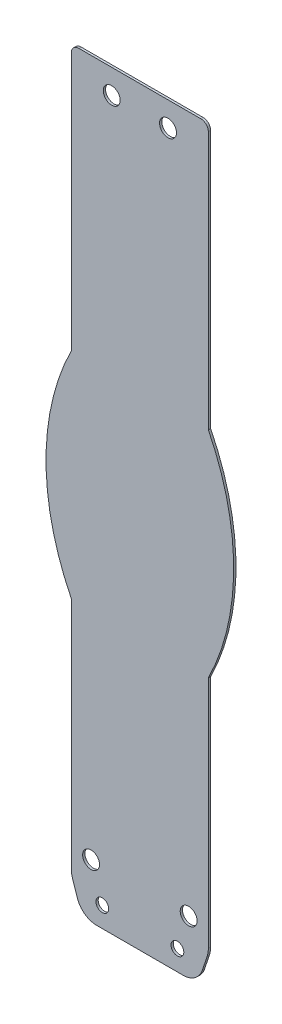
ISO-10303-21;
HEADER;
FILE_DESCRIPTION(('STEP AP214'),'2;1');
FILE_NAME('part.step','',(''),(''),'','','');
FILE_SCHEMA(('AUTOMOTIVE_DESIGN { 1 0 10303 214 1 1 1 1 }'));
ENDSEC;
DATA;
#1=APPLICATION_CONTEXT('core data for automotive mechanical design processes');
#2=APPLICATION_PROTOCOL_DEFINITION('international standard','automotive_design',2000,#1);
#3=PRODUCT_CONTEXT('',#1,'mechanical');
#4=PRODUCT('Part','Part','',(#3));
#5=PRODUCT_RELATED_PRODUCT_CATEGORY('part','',(#4));
#6=PRODUCT_DEFINITION_FORMATION('','',#4);
#7=PRODUCT_DEFINITION_CONTEXT('part definition',#1,'design');
#8=PRODUCT_DEFINITION('design','',#6,#7);
#9=PRODUCT_DEFINITION_SHAPE('','',#8);
#10=(LENGTH_UNIT() NAMED_UNIT(*) SI_UNIT(.MILLI.,.METRE.));
#11=(NAMED_UNIT(*) PLANE_ANGLE_UNIT() SI_UNIT($,.RADIAN.));
#12=(NAMED_UNIT(*) SI_UNIT($,.STERADIAN.) SOLID_ANGLE_UNIT());
#13=UNCERTAINTY_MEASURE_WITH_UNIT(LENGTH_MEASURE(1.E-05),#10,'distance_accuracy_value','');
#14=(GEOMETRIC_REPRESENTATION_CONTEXT(3) GLOBAL_UNCERTAINTY_ASSIGNED_CONTEXT((#13)) GLOBAL_UNIT_ASSIGNED_CONTEXT((#10,
#11,#12)) REPRESENTATION_CONTEXT('',''));
#15=CARTESIAN_POINT('',(0.,0.,0.));
#16=DIRECTION('',(0.,0.,1.));
#17=DIRECTION('',(1.,0.,0.));
#18=AXIS2_PLACEMENT_3D('',#15,#16,#17);
#19=CARTESIAN_POINT('',(36.5,9.57634436545453,0.6096));
#20=DIRECTION('',(-1.,0.,0.));
#21=DIRECTION('',(0.,0.,1.));
#22=AXIS2_PLACEMENT_3D('',#19,#20,#21);
#23=PLANE('',#22);
#24=DIRECTION('',(0.,0.,1.));
#25=VECTOR('',#24,1.);
#26=CARTESIAN_POINT('',(36.5,129.225,-75.9914509994381));
#27=LINE('',#26,#25);
#28=CARTESIAN_POINT('',(36.5,129.225,0.));
#29=VERTEX_POINT('',#28);
#30=CARTESIAN_POINT('',(36.5,129.225,0.6096));
#31=VERTEX_POINT('',#30);
#32=EDGE_CURVE('E178',#29,#31,#27,.T.);
#33=ORIENTED_EDGE('',*,*,#32,.F.);
#34=DIRECTION('',(0.,1.,0.));
#35=VECTOR('',#34,1.);
#36=CARTESIAN_POINT('',(36.5,9.57634436545453,0.));
#37=LINE('',#36,#35);
#38=CARTESIAN_POINT('',(36.5,198.,0.));
#39=VERTEX_POINT('',#38);
#40=EDGE_CURVE('E281',#29,#39,#37,.T.);
#41=ORIENTED_EDGE('',*,*,#40,.T.);
#42=DIRECTION('',(0.,0.,-1.));
#43=VECTOR('',#42,1.);
#44=CARTESIAN_POINT('',(36.5,198.,0.6096));
#45=LINE('',#44,#43);
#46=CARTESIAN_POINT('',(36.5,198.,0.6096));
#47=VERTEX_POINT('',#46);
#48=EDGE_CURVE('E181',#47,#39,#45,.T.);
#49=ORIENTED_EDGE('',*,*,#48,.F.);
#50=DIRECTION('',(0.,1.,0.));
#51=VECTOR('',#50,1.);
#52=CARTESIAN_POINT('',(36.5,9.57634436545453,0.6096));
#53=LINE('',#52,#51);
#54=EDGE_CURVE('E176',#31,#47,#53,.T.);
#55=ORIENTED_EDGE('',*,*,#54,.F.);
#56=EDGE_LOOP('',(#33,#41,#49,#55));
#57=FACE_BOUND('',#56,.T.);
#58=ADVANCED_FACE('F63',(#57),#23,.F.);
#59=CARTESIAN_POINT('',(0.,9.57634436545456,0.6096));
#60=DIRECTION('',(1.,0.,0.));
#61=DIRECTION('',(0.,0.,-1.));
#62=AXIS2_PLACEMENT_3D('',#59,#60,#61);
#63=PLANE('',#62);
#64=DIRECTION('',(0.,0.,1.));
#65=VECTOR('',#64,1.);
#66=CARTESIAN_POINT('',(0.,72.,-75.9914509994381));
#67=LINE('',#66,#65);
#68=CARTESIAN_POINT('',(0.,72.,0.));
#69=VERTEX_POINT('',#68);
#70=CARTESIAN_POINT('',(0.,72.,0.609600000000002));
#71=VERTEX_POINT('',#70);
#72=EDGE_CURVE('E209',#69,#71,#67,.T.);
#73=ORIENTED_EDGE('',*,*,#72,.F.);
#74=DIRECTION('',(0.,-1.,0.));
#75=VECTOR('',#74,1.);
#76=CARTESIAN_POINT('',(0.,9.57634436545456,0.));
#77=LINE('',#76,#75);
#78=CARTESIAN_POINT('',(0.,9.57634436545456,0.));
#79=VERTEX_POINT('',#78);
#80=EDGE_CURVE('E290',#69,#79,#77,.T.);
#81=ORIENTED_EDGE('',*,*,#80,.T.);
#82=DIRECTION('',(0.,0.,-1.));
#83=VECTOR('',#82,1.);
#84=CARTESIAN_POINT('',(0.,9.57634436545456,0.6096));
#85=LINE('',#84,#83);
#86=CARTESIAN_POINT('',(0.,9.57634436545456,0.6096));
#87=VERTEX_POINT('',#86);
#88=EDGE_CURVE('E311',#87,#79,#85,.T.);
#89=ORIENTED_EDGE('',*,*,#88,.F.);
#90=DIRECTION('',(0.,-1.,0.));
#91=VECTOR('',#90,1.);
#92=CARTESIAN_POINT('',(0.,9.57634436545456,0.6096));
#93=LINE('',#92,#91);
#94=EDGE_CURVE('E78',#71,#87,#93,.T.);
#95=ORIENTED_EDGE('',*,*,#94,.F.);
#96=EDGE_LOOP('',(#73,#81,#89,#95));
#97=FACE_BOUND('',#96,.T.);
#98=ADVANCED_FACE('F355',(#97),#63,.F.);
#99=DIRECTION('',(0.,0.,1.));
#100=VECTOR('',#99,1.);
#101=CARTESIAN_POINT('',(0.,129.225,-75.9914509994381));
#102=LINE('',#101,#100);
#103=CARTESIAN_POINT('',(0.,129.225,0.));
#104=VERTEX_POINT('',#103);
#105=CARTESIAN_POINT('',(0.,129.225,0.6096));
#106=VERTEX_POINT('',#105);
#107=EDGE_CURVE('E86',#104,#106,#102,.T.);
#108=ORIENTED_EDGE('',*,*,#107,.T.);
#109=CARTESIAN_POINT('',(0.,198.,0.6096));
#110=VERTEX_POINT('',#109);
#111=EDGE_CURVE('E264',#110,#106,#93,.T.);
#112=ORIENTED_EDGE('',*,*,#111,.F.);
#113=DIRECTION('',(0.,0.,-1.));
#114=VECTOR('',#113,1.);
#115=CARTESIAN_POINT('',(0.,198.,0.6096));
#116=LINE('',#115,#114);
#117=CARTESIAN_POINT('',(0.,198.,0.));
#118=VERTEX_POINT('',#117);
#119=EDGE_CURVE('E314',#110,#118,#116,.T.);
#120=ORIENTED_EDGE('',*,*,#119,.T.);
#121=EDGE_CURVE('E291',#118,#104,#77,.T.);
#122=ORIENTED_EDGE('',*,*,#121,.T.);
#123=EDGE_LOOP('',(#108,#112,#120,#122));
#124=FACE_BOUND('',#123,.T.);
#125=ADVANCED_FACE('F359',(#124),#63,.F.);
#126=CARTESIAN_POINT('',(29.7625562615952,5.4,0.6096));
#127=DIRECTION('',(0.,0.,-1.));
#128=DIRECTION('',(-1.,0.,0.));
#129=AXIS2_PLACEMENT_3D('',#126,#127,#128);
#130=CYLINDRICAL_SURFACE('',#129,5.4);
#131=CARTESIAN_POINT('',(29.7625562615952,5.4,0.));
#132=DIRECTION('',(0.,0.,1.));
#133=DIRECTION('',(-1.,0.,0.));
#134=AXIS2_PLACEMENT_3D('',#131,#132,#133);
#135=CIRCLE('',#134,5.4);
#136=CARTESIAN_POINT('',(29.7625562615952,0.,0.));
#137=VERTEX_POINT('',#136);
#138=CARTESIAN_POINT('',(34.8835039997087,3.68655485541252,0.));
#139=VERTEX_POINT('',#138);
#140=EDGE_CURVE('E248',#137,#139,#135,.T.);
#141=ORIENTED_EDGE('',*,*,#140,.T.);
#142=DIRECTION('',(0.,0.,-1.));
#143=VECTOR('',#142,1.);
#144=CARTESIAN_POINT('',(34.8835039997087,3.68655485541252,0.6096));
#145=LINE('',#144,#143);
#146=CARTESIAN_POINT('',(34.8835039997087,3.68655485541252,0.6096));
#147=VERTEX_POINT('',#146);
#148=EDGE_CURVE('E12',#147,#139,#145,.T.);
#149=ORIENTED_EDGE('',*,*,#148,.F.);
#150=CARTESIAN_POINT('',(29.7625562615952,5.4,0.6096));
#151=DIRECTION('',(0.,0.,1.));
#152=DIRECTION('',(-1.,0.,0.));
#153=AXIS2_PLACEMENT_3D('',#150,#151,#152);
#154=CIRCLE('',#153,5.4);
#155=CARTESIAN_POINT('',(29.7625562615952,0.,0.6096));
#156=VERTEX_POINT('',#155);
#157=EDGE_CURVE('E251',#156,#147,#154,.T.);
#158=ORIENTED_EDGE('',*,*,#157,.F.);
#159=DIRECTION('',(0.,0.,-1.));
#160=VECTOR('',#159,1.);
#161=CARTESIAN_POINT('',(29.7625562615952,0.,0.6096));
#162=LINE('',#161,#160);
#163=EDGE_CURVE('E274',#156,#137,#162,.T.);
#164=ORIENTED_EDGE('',*,*,#163,.T.);
#165=EDGE_LOOP('',(#141,#149,#158,#164));
#166=FACE_BOUND('',#165,.T.);
#167=ADVANCED_FACE('F65',(#166),#130,.T.);
#168=CARTESIAN_POINT('',(34.8835039997087,3.68655485541252,0.6096));
#169=DIRECTION('',(-0.948323655206201,0.317304656405088,0.));
#170=DIRECTION('',(-0.317304656405088,-0.948323655206201,0.));
#171=AXIS2_PLACEMENT_3D('',#168,#169,#170);
#172=PLANE('',#171);
#173=DIRECTION('',(0.317304656405088,0.948323655206201,0.));
#174=VECTOR('',#173,1.);
#175=CARTESIAN_POINT('',(34.8835039997087,3.68655485541252,0.));
#176=LINE('',#175,#174);
#177=CARTESIAN_POINT('',(36.1641037588403,7.51386409882145,0.));
#178=VERTEX_POINT('',#177);
#179=EDGE_CURVE('E277',#139,#178,#176,.T.);
#180=ORIENTED_EDGE('',*,*,#179,.T.);
#181=DIRECTION('',(0.,0.,-1.));
#182=VECTOR('',#181,1.);
#183=CARTESIAN_POINT('',(36.1641037588403,7.51386409882145,0.6096));
#184=LINE('',#183,#182);
#185=CARTESIAN_POINT('',(36.1641037588403,7.51386409882145,0.6096));
#186=VERTEX_POINT('',#185);
#187=EDGE_CURVE('E71',#186,#178,#184,.T.);
#188=ORIENTED_EDGE('',*,*,#187,.F.);
#189=DIRECTION('',(0.317304656405088,0.948323655206201,0.));
#190=VECTOR('',#189,1.);
#191=CARTESIAN_POINT('',(34.8835039997087,3.68655485541252,0.6096));
#192=LINE('',#191,#190);
#193=EDGE_CURVE('E254',#147,#186,#192,.T.);
#194=ORIENTED_EDGE('',*,*,#193,.F.);
#195=ORIENTED_EDGE('',*,*,#148,.T.);
#196=EDGE_LOOP('',(#180,#188,#194,#195));
#197=FACE_BOUND('',#196,.T.);
#198=ADVANCED_FACE('F352',(#197),#172,.F.);
#199=CARTESIAN_POINT('',(30.,9.57634436545453,0.6096));
#200=DIRECTION('',(0.,0.,-1.));
#201=DIRECTION('',(-1.,0.,0.));
#202=AXIS2_PLACEMENT_3D('',#199,#200,#201);
#203=CYLINDRICAL_SURFACE('',#202,6.5);
#204=CARTESIAN_POINT('',(30.,9.57634436545453,0.));
#205=DIRECTION('',(0.,0.,1.));
#206=DIRECTION('',(1.,0.,0.));
#207=AXIS2_PLACEMENT_3D('',#204,#205,#206);
#208=CIRCLE('',#207,6.5);
#209=CARTESIAN_POINT('',(36.5,9.57634436545453,0.));
#210=VERTEX_POINT('',#209);
#211=EDGE_CURVE('E279',#178,#210,#208,.T.);
#212=ORIENTED_EDGE('',*,*,#211,.T.);
#213=DIRECTION('',(0.,0.,-1.));
#214=VECTOR('',#213,1.);
#215=CARTESIAN_POINT('',(36.5,9.57634436545453,0.6096));
#216=LINE('',#215,#214);
#217=CARTESIAN_POINT('',(36.5,9.57634436545453,0.6096));
#218=VERTEX_POINT('',#217);
#219=EDGE_CURVE('E324',#218,#210,#216,.T.);
#220=ORIENTED_EDGE('',*,*,#219,.F.);
#221=CARTESIAN_POINT('',(30.,9.57634436545453,0.6096));
#222=DIRECTION('',(0.,0.,1.));
#223=DIRECTION('',(1.,0.,0.));
#224=AXIS2_PLACEMENT_3D('',#221,#222,#223);
#225=CIRCLE('',#224,6.5);
#226=EDGE_CURVE('E186',#186,#218,#225,.T.);
#227=ORIENTED_EDGE('',*,*,#226,.F.);
#228=ORIENTED_EDGE('',*,*,#187,.T.);
#229=EDGE_LOOP('',(#212,#220,#227,#228));
#230=FACE_BOUND('',#229,.T.);
#231=ADVANCED_FACE('F331',(#230),#203,.T.);
#232=CARTESIAN_POINT('',(36.5,72.,0.));
#233=VERTEX_POINT('',#232);
#234=EDGE_CURVE('E282',#210,#233,#37,.T.);
#235=ORIENTED_EDGE('',*,*,#234,.T.);
#236=DIRECTION('',(0.,0.,1.));
#237=VECTOR('',#236,1.);
#238=CARTESIAN_POINT('',(36.5,72.,-75.9914509994381));
#239=LINE('',#238,#237);
#240=CARTESIAN_POINT('',(36.5,72.,0.609600000000002));
#241=VERTEX_POINT('',#240);
#242=EDGE_CURVE('E212',#233,#241,#239,.T.);
#243=ORIENTED_EDGE('',*,*,#242,.T.);
#244=EDGE_CURVE('E185',#218,#241,#53,.T.);
#245=ORIENTED_EDGE('',*,*,#244,.F.);
#246=ORIENTED_EDGE('',*,*,#219,.T.);
#247=EDGE_LOOP('',(#235,#243,#245,#246));
#248=FACE_BOUND('',#247,.T.);
#249=ADVANCED_FACE('F341',(#248),#23,.F.);
#250=CARTESIAN_POINT('',(34.5,198.,0.6096));
#251=DIRECTION('',(0.,0.,-1.));
#252=DIRECTION('',(-1.,0.,0.));
#253=AXIS2_PLACEMENT_3D('',#250,#251,#252);
#254=CYLINDRICAL_SURFACE('',#253,2.);
#255=CARTESIAN_POINT('',(34.5,198.,0.));
#256=DIRECTION('',(0.,0.,1.));
#257=DIRECTION('',(-1.,0.,0.));
#258=AXIS2_PLACEMENT_3D('',#255,#256,#257);
#259=CIRCLE('',#258,2.);
#260=CARTESIAN_POINT('',(34.5,200.,0.));
#261=VERTEX_POINT('',#260);
#262=EDGE_CURVE('E284',#39,#261,#259,.T.);
#263=ORIENTED_EDGE('',*,*,#262,.T.);
#264=DIRECTION('',(0.,0.,-1.));
#265=VECTOR('',#264,1.);
#266=CARTESIAN_POINT('',(34.5,200.,0.6096));
#267=LINE('',#266,#265);
#268=CARTESIAN_POINT('',(34.5,200.,0.6096));
#269=VERTEX_POINT('',#268);
#270=EDGE_CURVE('E320',#269,#261,#267,.T.);
#271=ORIENTED_EDGE('',*,*,#270,.F.);
#272=CARTESIAN_POINT('',(34.5,198.,0.6096));
#273=DIRECTION('',(0.,0.,1.));
#274=DIRECTION('',(-1.,0.,0.));
#275=AXIS2_PLACEMENT_3D('',#272,#273,#274);
#276=CIRCLE('',#275,2.);
#277=EDGE_CURVE('E258',#47,#269,#276,.T.);
#278=ORIENTED_EDGE('',*,*,#277,.F.);
#279=ORIENTED_EDGE('',*,*,#48,.T.);
#280=EDGE_LOOP('',(#263,#271,#278,#279));
#281=FACE_BOUND('',#280,.T.);
#282=ADVANCED_FACE('F343',(#281),#254,.T.);
#283=CARTESIAN_POINT('',(2.00000000000001,200.,0.6096));
#284=DIRECTION('',(0.,-1.,0.));
#285=DIRECTION('',(0.,0.,-1.));
#286=AXIS2_PLACEMENT_3D('',#283,#284,#285);
#287=PLANE('',#286);
#288=DIRECTION('',(-1.,0.,0.));
#289=VECTOR('',#288,1.);
#290=CARTESIAN_POINT('',(2.00000000000001,200.,0.));
#291=LINE('',#290,#289);
#292=CARTESIAN_POINT('',(2.00000000000001,200.,0.));
#293=VERTEX_POINT('',#292);
#294=EDGE_CURVE('E286',#261,#293,#291,.T.);
#295=ORIENTED_EDGE('',*,*,#294,.T.);
#296=DIRECTION('',(0.,0.,-1.));
#297=VECTOR('',#296,1.);
#298=CARTESIAN_POINT('',(2.00000000000001,200.,0.6096));
#299=LINE('',#298,#297);
#300=CARTESIAN_POINT('',(2.00000000000001,200.,0.6096));
#301=VERTEX_POINT('',#300);
#302=EDGE_CURVE('E317',#301,#293,#299,.T.);
#303=ORIENTED_EDGE('',*,*,#302,.F.);
#304=DIRECTION('',(-1.,0.,0.));
#305=VECTOR('',#304,1.);
#306=CARTESIAN_POINT('',(2.00000000000001,200.,0.6096));
#307=LINE('',#306,#305);
#308=EDGE_CURVE('E260',#269,#301,#307,.T.);
#309=ORIENTED_EDGE('',*,*,#308,.F.);
#310=ORIENTED_EDGE('',*,*,#270,.T.);
#311=EDGE_LOOP('',(#295,#303,#309,#310));
#312=FACE_BOUND('',#311,.T.);
#313=ADVANCED_FACE('F349',(#312),#287,.F.);
#314=CARTESIAN_POINT('',(2.,198.,0.6096));
#315=DIRECTION('',(0.,0.,-1.));
#316=DIRECTION('',(-1.,0.,0.));
#317=AXIS2_PLACEMENT_3D('',#314,#315,#316);
#318=CYLINDRICAL_SURFACE('',#317,2.);
#319=CARTESIAN_POINT('',(2.,198.,0.));
#320=DIRECTION('',(0.,0.,1.));
#321=DIRECTION('',(-1.,0.,0.));
#322=AXIS2_PLACEMENT_3D('',#319,#320,#321);
#323=CIRCLE('',#322,2.);
#324=EDGE_CURVE('E288',#293,#118,#323,.T.);
#325=ORIENTED_EDGE('',*,*,#324,.T.);
#326=ORIENTED_EDGE('',*,*,#119,.F.);
#327=CARTESIAN_POINT('',(2.,198.,0.6096));
#328=DIRECTION('',(0.,0.,1.));
#329=DIRECTION('',(-1.,0.,0.));
#330=AXIS2_PLACEMENT_3D('',#327,#328,#329);
#331=CIRCLE('',#330,2.);
#332=EDGE_CURVE('E262',#301,#110,#331,.T.);
#333=ORIENTED_EDGE('',*,*,#332,.F.);
#334=ORIENTED_EDGE('',*,*,#302,.T.);
#335=EDGE_LOOP('',(#325,#326,#333,#334));
#336=FACE_BOUND('',#335,.T.);
#337=ADVANCED_FACE('F368',(#336),#318,.T.);
#338=CARTESIAN_POINT('',(6.5,9.57634436545456,0.6096));
#339=DIRECTION('',(0.,0.,-1.));
#340=DIRECTION('',(-1.,0.,0.));
#341=AXIS2_PLACEMENT_3D('',#338,#339,#340);
#342=CYLINDRICAL_SURFACE('',#341,6.5);
#343=CARTESIAN_POINT('',(6.5,9.57634436545456,0.));
#344=DIRECTION('',(0.,0.,1.));
#345=DIRECTION('',(-1.,0.,0.));
#346=AXIS2_PLACEMENT_3D('',#343,#344,#345);
#347=CIRCLE('',#346,6.5);
#348=CARTESIAN_POINT('',(0.335896241159713,7.51386409882143,0.));
#349=VERTEX_POINT('',#348);
#350=EDGE_CURVE('E293',#79,#349,#347,.T.);
#351=ORIENTED_EDGE('',*,*,#350,.T.);
#352=DIRECTION('',(0.,0.,-1.));
#353=VECTOR('',#352,1.);
#354=CARTESIAN_POINT('',(0.335896241159713,7.51386409882143,0.6096));
#355=LINE('',#354,#353);
#356=CARTESIAN_POINT('',(0.335896241159713,7.51386409882143,0.6096));
#357=VERTEX_POINT('',#356);
#358=EDGE_CURVE('E308',#357,#349,#355,.T.);
#359=ORIENTED_EDGE('',*,*,#358,.F.);
#360=CARTESIAN_POINT('',(6.5,9.57634436545456,0.6096));
#361=DIRECTION('',(0.,0.,1.));
#362=DIRECTION('',(-1.,0.,0.));
#363=AXIS2_PLACEMENT_3D('',#360,#361,#362);
#364=CIRCLE('',#363,6.5);
#365=EDGE_CURVE('E266',#87,#357,#364,.T.);
#366=ORIENTED_EDGE('',*,*,#365,.F.);
#367=ORIENTED_EDGE('',*,*,#88,.T.);
#368=EDGE_LOOP('',(#351,#359,#366,#367));
#369=FACE_BOUND('',#368,.T.);
#370=ADVANCED_FACE('F366',(#369),#342,.T.);
#371=CARTESIAN_POINT('',(1.61649600029139,3.68655485541248,0.6096));
#372=DIRECTION('',(0.948323655206198,0.317304656405097,0.));
#373=DIRECTION('',(-0.317304656405097,0.948323655206198,0.));
#374=AXIS2_PLACEMENT_3D('',#371,#372,#373);
#375=PLANE('',#374);
#376=DIRECTION('',(0.317304656405097,-0.948323655206198,0.));
#377=VECTOR('',#376,1.);
#378=CARTESIAN_POINT('',(1.61649600029139,3.68655485541248,0.));
#379=LINE('',#378,#377);
#380=CARTESIAN_POINT('',(1.61649600029139,3.68655485541248,0.));
#381=VERTEX_POINT('',#380);
#382=EDGE_CURVE('E295',#349,#381,#379,.T.);
#383=ORIENTED_EDGE('',*,*,#382,.T.);
#384=DIRECTION('',(0.,0.,-1.));
#385=VECTOR('',#384,1.);
#386=CARTESIAN_POINT('',(1.61649600029139,3.68655485541248,0.6096));
#387=LINE('',#386,#385);
#388=CARTESIAN_POINT('',(1.61649600029139,3.68655485541248,0.6096));
#389=VERTEX_POINT('',#388);
#390=EDGE_CURVE('E305',#389,#381,#387,.T.);
#391=ORIENTED_EDGE('',*,*,#390,.F.);
#392=DIRECTION('',(0.317304656405097,-0.948323655206198,0.));
#393=VECTOR('',#392,1.);
#394=CARTESIAN_POINT('',(1.61649600029139,3.68655485541248,0.6096));
#395=LINE('',#394,#393);
#396=EDGE_CURVE('E268',#357,#389,#395,.T.);
#397=ORIENTED_EDGE('',*,*,#396,.F.);
#398=ORIENTED_EDGE('',*,*,#358,.T.);
#399=EDGE_LOOP('',(#383,#391,#397,#398));
#400=FACE_BOUND('',#399,.T.);
#401=ADVANCED_FACE('F398',(#400),#375,.F.);
#402=CARTESIAN_POINT('',(6.73744373840486,5.4,0.6096));
#403=DIRECTION('',(0.,0.,-1.));
#404=DIRECTION('',(-1.,0.,0.));
#405=AXIS2_PLACEMENT_3D('',#402,#403,#404);
#406=CYLINDRICAL_SURFACE('',#405,5.4);
#407=CARTESIAN_POINT('',(6.73744373840486,5.4,0.));
#408=DIRECTION('',(0.,0.,1.));
#409=DIRECTION('',(1.,0.,0.));
#410=AXIS2_PLACEMENT_3D('',#407,#408,#409);
#411=CIRCLE('',#410,5.4);
#412=CARTESIAN_POINT('',(6.73744373840486,0.,0.));
#413=VERTEX_POINT('',#412);
#414=EDGE_CURVE('E297',#381,#413,#411,.T.);
#415=ORIENTED_EDGE('',*,*,#414,.T.);
#416=DIRECTION('',(0.,0.,-1.));
#417=VECTOR('',#416,1.);
#418=CARTESIAN_POINT('',(6.73744373840486,0.,0.6096));
#419=LINE('',#418,#417);
#420=CARTESIAN_POINT('',(6.73744373840486,0.,0.6096));
#421=VERTEX_POINT('',#420);
#422=EDGE_CURVE('E302',#421,#413,#419,.T.);
#423=ORIENTED_EDGE('',*,*,#422,.F.);
#424=CARTESIAN_POINT('',(6.73744373840486,5.4,0.6096));
#425=DIRECTION('',(0.,0.,1.));
#426=DIRECTION('',(1.,0.,0.));
#427=AXIS2_PLACEMENT_3D('',#424,#425,#426);
#428=CIRCLE('',#427,5.4);
#429=EDGE_CURVE('E270',#389,#421,#428,.T.);
#430=ORIENTED_EDGE('',*,*,#429,.F.);
#431=ORIENTED_EDGE('',*,*,#390,.T.);
#432=EDGE_LOOP('',(#415,#423,#430,#431));
#433=FACE_BOUND('',#432,.T.);
#434=ADVANCED_FACE('F405',(#433),#406,.T.);
#435=CARTESIAN_POINT('',(6.73744373840486,0.,0.6096));
#436=DIRECTION('',(0.,1.,0.));
#437=DIRECTION('',(0.,0.,1.));
#438=AXIS2_PLACEMENT_3D('',#435,#436,#437);
#439=PLANE('',#438);
#440=DIRECTION('',(1.,0.,0.));
#441=VECTOR('',#440,1.);
#442=CARTESIAN_POINT('',(6.73744373840486,0.,0.));
#443=LINE('',#442,#441);
#444=EDGE_CURVE('E255',#413,#137,#443,.T.);
#445=ORIENTED_EDGE('',*,*,#444,.T.);
#446=ORIENTED_EDGE('',*,*,#163,.F.);
#447=DIRECTION('',(1.,0.,0.));
#448=VECTOR('',#447,1.);
#449=CARTESIAN_POINT('',(6.73744373840486,0.,0.6096));
#450=LINE('',#449,#448);
#451=EDGE_CURVE('E272',#421,#156,#450,.T.);
#452=ORIENTED_EDGE('',*,*,#451,.F.);
#453=ORIENTED_EDGE('',*,*,#422,.T.);
#454=EDGE_LOOP('',(#445,#446,#452,#453));
#455=FACE_BOUND('',#454,.T.);
#456=ADVANCED_FACE('F408',(#455),#439,.F.);
#457=CARTESIAN_POINT('',(29.7625562615952,5.4,0.6096));
#458=DIRECTION('',(0.,0.,-1.));
#459=DIRECTION('',(-1.,0.,0.));
#460=AXIS2_PLACEMENT_3D('',#457,#458,#459);
#461=PLANE('',#460);
#462=CARTESIAN_POINT('',(5.25,14.4,0.6096));
#463=DIRECTION('',(0.,0.,1.));
#464=DIRECTION('',(1.,0.,0.));
#465=AXIS2_PLACEMENT_3D('',#462,#463,#464);
#466=CIRCLE('',#465,2.25);
#467=CARTESIAN_POINT('',(7.5,14.4,0.6096));
#468=VERTEX_POINT('',#467);
#469=EDGE_CURVE('E225',#468,#468,#466,.T.);
#470=ORIENTED_EDGE('',*,*,#469,.F.);
#471=EDGE_LOOP('',(#470));
#472=FACE_BOUND('',#471,.T.);
#473=CARTESIAN_POINT('',(28.25,5.4,0.6096));
#474=DIRECTION('',(0.,0.,1.));
#475=DIRECTION('',(-1.,0.,0.));
#476=AXIS2_PLACEMENT_3D('',#473,#474,#475);
#477=CIRCLE('',#476,1.7);
#478=CARTESIAN_POINT('',(26.55,5.4,0.6096));
#479=VERTEX_POINT('',#478);
#480=EDGE_CURVE('E237',#479,#479,#477,.T.);
#481=ORIENTED_EDGE('',*,*,#480,.F.);
#482=EDGE_LOOP('',(#481));
#483=FACE_BOUND('',#482,.T.);
#484=CARTESIAN_POINT('',(31.25,14.4,0.6096));
#485=DIRECTION('',(0.,0.,1.));
#486=DIRECTION('',(-1.,0.,0.));
#487=AXIS2_PLACEMENT_3D('',#484,#485,#486);
#488=CIRCLE('',#487,2.25000000000001);
#489=CARTESIAN_POINT('',(29.,14.4,0.6096));
#490=VERTEX_POINT('',#489);
#491=EDGE_CURVE('E218',#490,#490,#488,.T.);
#492=ORIENTED_EDGE('',*,*,#491,.F.);
#493=EDGE_LOOP('',(#492));
#494=FACE_BOUND('',#493,.T.);
#495=CARTESIAN_POINT('',(8.25,5.4,0.6096));
#496=DIRECTION('',(0.,0.,1.));
#497=DIRECTION('',(1.,0.,0.));
#498=AXIS2_PLACEMENT_3D('',#495,#496,#497);
#499=CIRCLE('',#498,1.7);
#500=CARTESIAN_POINT('',(9.95,5.4,0.6096));
#501=VERTEX_POINT('',#500);
#502=EDGE_CURVE('E224',#501,#501,#499,.T.);
#503=ORIENTED_EDGE('',*,*,#502,.F.);
#504=EDGE_LOOP('',(#503));
#505=FACE_BOUND('',#504,.T.);
#506=ORIENTED_EDGE('',*,*,#244,.T.);
#507=CARTESIAN_POINT('',(-20.7676041666667,100.6125,0.6096));
#508=DIRECTION('',(0.,0.,1.));
#509=DIRECTION('',(1.,0.,0.));
#510=AXIS2_PLACEMENT_3D('',#507,#508,#509);
#511=CIRCLE('',#510,64.0176041666667);
#512=EDGE_CURVE('E193',#241,#31,#511,.T.);
#513=ORIENTED_EDGE('',*,*,#512,.T.);
#514=ORIENTED_EDGE('',*,*,#54,.T.);
#515=ORIENTED_EDGE('',*,*,#277,.T.);
#516=ORIENTED_EDGE('',*,*,#308,.T.);
#517=ORIENTED_EDGE('',*,*,#332,.T.);
#518=ORIENTED_EDGE('',*,*,#111,.T.);
#519=CARTESIAN_POINT('',(57.2676041666667,100.6125,0.6096));
#520=DIRECTION('',(0.,0.,1.));
#521=DIRECTION('',(1.,0.,0.));
#522=AXIS2_PLACEMENT_3D('',#519,#520,#521);
#523=CIRCLE('',#522,64.0176041666667);
#524=EDGE_CURVE('E207',#71,#106,#523,.F.);
#525=ORIENTED_EDGE('',*,*,#524,.F.);
#526=ORIENTED_EDGE('',*,*,#94,.T.);
#527=ORIENTED_EDGE('',*,*,#365,.T.);
#528=ORIENTED_EDGE('',*,*,#396,.T.);
#529=ORIENTED_EDGE('',*,*,#429,.T.);
#530=ORIENTED_EDGE('',*,*,#451,.T.);
#531=ORIENTED_EDGE('',*,*,#157,.T.);
#532=ORIENTED_EDGE('',*,*,#193,.T.);
#533=ORIENTED_EDGE('',*,*,#226,.T.);
#534=EDGE_LOOP('',(#506,#513,#514,#515,#516,#517,#518,#525,#526,#527,#528,#529,#530,#531,#532,#533));
#535=FACE_BOUND('',#534,.T.);
#536=CARTESIAN_POINT('',(25.75,193.5,0.6096));
#537=DIRECTION('',(0.,0.,1.));
#538=DIRECTION('',(-1.,0.,0.));
#539=AXIS2_PLACEMENT_3D('',#536,#537,#538);
#540=CIRCLE('',#539,2.25);
#541=CARTESIAN_POINT('',(23.5,193.5,0.6096));
#542=VERTEX_POINT('',#541);
#543=EDGE_CURVE('E214',#542,#542,#540,.T.);
#544=ORIENTED_EDGE('',*,*,#543,.F.);
#545=EDGE_LOOP('',(#544));
#546=FACE_BOUND('',#545,.T.);
#547=CARTESIAN_POINT('',(10.75,193.5,0.6096));
#548=DIRECTION('',(0.,0.,1.));
#549=DIRECTION('',(1.,0.,0.));
#550=AXIS2_PLACEMENT_3D('',#547,#548,#549);
#551=CIRCLE('',#550,2.25);
#552=CARTESIAN_POINT('',(13.,193.5,0.6096));
#553=VERTEX_POINT('',#552);
#554=EDGE_CURVE('E231',#553,#553,#551,.T.);
#555=ORIENTED_EDGE('',*,*,#554,.F.);
#556=EDGE_LOOP('',(#555));
#557=FACE_BOUND('',#556,.T.);
#558=ADVANCED_FACE('F198',(#472,#483,#494,#505,#535,#546,#557),#461,.F.);
#559=CARTESIAN_POINT('',(29.7625562615952,5.4,0.));
#560=DIRECTION('',(0.,0.,-1.));
#561=DIRECTION('',(-1.,0.,0.));
#562=AXIS2_PLACEMENT_3D('',#559,#560,#561);
#563=PLANE('',#562);
#564=ORIENTED_EDGE('',*,*,#80,.F.);
#565=CARTESIAN_POINT('',(57.2676041666667,100.6125,0.));
#566=DIRECTION('',(0.,0.,-1.));
#567=DIRECTION('',(-1.,0.,0.));
#568=AXIS2_PLACEMENT_3D('',#565,#566,#567);
#569=CIRCLE('',#568,64.0176041666667);
#570=EDGE_CURVE('E201',#69,#104,#569,.T.);
#571=ORIENTED_EDGE('',*,*,#570,.T.);
#572=ORIENTED_EDGE('',*,*,#121,.F.);
#573=ORIENTED_EDGE('',*,*,#324,.F.);
#574=ORIENTED_EDGE('',*,*,#294,.F.);
#575=ORIENTED_EDGE('',*,*,#262,.F.);
#576=ORIENTED_EDGE('',*,*,#40,.F.);
#577=CARTESIAN_POINT('',(-20.7676041666667,100.6125,0.));
#578=DIRECTION('',(0.,0.,-1.));
#579=DIRECTION('',(-1.,0.,0.));
#580=AXIS2_PLACEMENT_3D('',#577,#578,#579);
#581=CIRCLE('',#580,64.0176041666667);
#582=EDGE_CURVE('E195',#233,#29,#581,.F.);
#583=ORIENTED_EDGE('',*,*,#582,.F.);
#584=ORIENTED_EDGE('',*,*,#234,.F.);
#585=ORIENTED_EDGE('',*,*,#211,.F.);
#586=ORIENTED_EDGE('',*,*,#179,.F.);
#587=ORIENTED_EDGE('',*,*,#140,.F.);
#588=ORIENTED_EDGE('',*,*,#444,.F.);
#589=ORIENTED_EDGE('',*,*,#414,.F.);
#590=ORIENTED_EDGE('',*,*,#382,.F.);
#591=ORIENTED_EDGE('',*,*,#350,.F.);
#592=EDGE_LOOP('',(#564,#571,#572,#573,#574,#575,#576,#583,#584,#585,#586,#587,#588,#589,#590,#591));
#593=FACE_BOUND('',#592,.T.);
#594=CARTESIAN_POINT('',(5.25,14.4,0.));
#595=DIRECTION('',(0.,0.,1.));
#596=DIRECTION('',(1.,0.,0.));
#597=AXIS2_PLACEMENT_3D('',#594,#595,#596);
#598=CIRCLE('',#597,2.25);
#599=CARTESIAN_POINT('',(7.5,14.4,0.));
#600=VERTEX_POINT('',#599);
#601=EDGE_CURVE('E221',#600,#600,#598,.T.);
#602=ORIENTED_EDGE('',*,*,#601,.T.);
#603=EDGE_LOOP('',(#602));
#604=FACE_BOUND('',#603,.T.);
#605=CARTESIAN_POINT('',(28.25,5.4,0.));
#606=DIRECTION('',(0.,0.,1.));
#607=DIRECTION('',(-1.,0.,0.));
#608=AXIS2_PLACEMENT_3D('',#605,#606,#607);
#609=CIRCLE('',#608,1.7);
#610=CARTESIAN_POINT('',(26.55,5.4,0.));
#611=VERTEX_POINT('',#610);
#612=EDGE_CURVE('E234',#611,#611,#609,.T.);
#613=ORIENTED_EDGE('',*,*,#612,.T.);
#614=EDGE_LOOP('',(#613));
#615=FACE_BOUND('',#614,.T.);
#616=CARTESIAN_POINT('',(31.25,14.4,0.));
#617=DIRECTION('',(0.,0.,1.));
#618=DIRECTION('',(-1.,0.,0.));
#619=AXIS2_PLACEMENT_3D('',#616,#617,#618);
#620=CIRCLE('',#619,2.25000000000001);
#621=CARTESIAN_POINT('',(29.,14.4,0.));
#622=VERTEX_POINT('',#621);
#623=EDGE_CURVE('E240',#622,#622,#620,.T.);
#624=ORIENTED_EDGE('',*,*,#623,.T.);
#625=EDGE_LOOP('',(#624));
#626=FACE_BOUND('',#625,.T.);
#627=CARTESIAN_POINT('',(8.25,5.4,0.));
#628=DIRECTION('',(0.,0.,1.));
#629=DIRECTION('',(1.,0.,0.));
#630=AXIS2_PLACEMENT_3D('',#627,#628,#629);
#631=CIRCLE('',#630,1.7);
#632=CARTESIAN_POINT('',(9.95,5.4,0.));
#633=VERTEX_POINT('',#632);
#634=EDGE_CURVE('E245',#633,#633,#631,.T.);
#635=ORIENTED_EDGE('',*,*,#634,.T.);
#636=EDGE_LOOP('',(#635));
#637=FACE_BOUND('',#636,.T.);
#638=CARTESIAN_POINT('',(25.75,193.5,0.));
#639=DIRECTION('',(0.,0.,1.));
#640=DIRECTION('',(-1.,0.,0.));
#641=AXIS2_PLACEMENT_3D('',#638,#639,#640);
#642=CIRCLE('',#641,2.25);
#643=CARTESIAN_POINT('',(23.5,193.5,0.));
#644=VERTEX_POINT('',#643);
#645=EDGE_CURVE('E215',#644,#644,#642,.T.);
#646=ORIENTED_EDGE('',*,*,#645,.T.);
#647=EDGE_LOOP('',(#646));
#648=FACE_BOUND('',#647,.T.);
#649=CARTESIAN_POINT('',(10.75,193.5,0.));
#650=DIRECTION('',(0.,0.,1.));
#651=DIRECTION('',(1.,0.,0.));
#652=AXIS2_PLACEMENT_3D('',#649,#650,#651);
#653=CIRCLE('',#652,2.25);
#654=CARTESIAN_POINT('',(13.,193.5,0.));
#655=VERTEX_POINT('',#654);
#656=EDGE_CURVE('E228',#655,#655,#653,.T.);
#657=ORIENTED_EDGE('',*,*,#656,.T.);
#658=EDGE_LOOP('',(#657));
#659=FACE_BOUND('',#658,.T.);
#660=ADVANCED_FACE('F337',(#593,#604,#615,#626,#637,#648,#659),#563,.T.);
#661=CARTESIAN_POINT('',(8.25,5.4,0.));
#662=DIRECTION('',(0.,0.,1.));
#663=DIRECTION('',(1.,0.,0.));
#664=AXIS2_PLACEMENT_3D('',#661,#662,#663);
#665=CYLINDRICAL_SURFACE('',#664,1.7);
#666=ORIENTED_EDGE('',*,*,#634,.F.);
#667=EDGE_LOOP('',(#666));
#668=FACE_BOUND('',#667,.T.);
#669=ORIENTED_EDGE('',*,*,#502,.T.);
#670=EDGE_LOOP('',(#669));
#671=FACE_BOUND('',#670,.T.);
#672=ADVANCED_FACE('F452',(#668,#671),#665,.F.);
#673=CARTESIAN_POINT('',(25.75,193.5,0.));
#674=DIRECTION('',(0.,0.,1.));
#675=DIRECTION('',(1.,0.,0.));
#676=AXIS2_PLACEMENT_3D('',#673,#674,#675);
#677=CYLINDRICAL_SURFACE('',#676,2.25);
#678=ORIENTED_EDGE('',*,*,#645,.F.);
#679=EDGE_LOOP('',(#678));
#680=FACE_BOUND('',#679,.T.);
#681=ORIENTED_EDGE('',*,*,#543,.T.);
#682=EDGE_LOOP('',(#681));
#683=FACE_BOUND('',#682,.T.);
#684=ADVANCED_FACE('F480',(#680,#683),#677,.F.);
#685=CARTESIAN_POINT('',(31.25,14.4,0.));
#686=DIRECTION('',(0.,0.,1.));
#687=DIRECTION('',(1.,0.,0.));
#688=AXIS2_PLACEMENT_3D('',#685,#686,#687);
#689=CYLINDRICAL_SURFACE('',#688,2.25000000000001);
#690=ORIENTED_EDGE('',*,*,#623,.F.);
#691=EDGE_LOOP('',(#690));
#692=FACE_BOUND('',#691,.T.);
#693=ORIENTED_EDGE('',*,*,#491,.T.);
#694=EDGE_LOOP('',(#693));
#695=FACE_BOUND('',#694,.T.);
#696=ADVANCED_FACE('F483',(#692,#695),#689,.F.);
#697=CARTESIAN_POINT('',(28.25,5.4,0.));
#698=DIRECTION('',(0.,0.,1.));
#699=DIRECTION('',(1.,0.,0.));
#700=AXIS2_PLACEMENT_3D('',#697,#698,#699);
#701=CYLINDRICAL_SURFACE('',#700,1.7);
#702=ORIENTED_EDGE('',*,*,#612,.F.);
#703=EDGE_LOOP('',(#702));
#704=FACE_BOUND('',#703,.T.);
#705=ORIENTED_EDGE('',*,*,#480,.T.);
#706=EDGE_LOOP('',(#705));
#707=FACE_BOUND('',#706,.T.);
#708=ADVANCED_FACE('F490',(#704,#707),#701,.F.);
#709=CARTESIAN_POINT('',(10.75,193.5,0.));
#710=DIRECTION('',(0.,0.,1.));
#711=DIRECTION('',(1.,0.,0.));
#712=AXIS2_PLACEMENT_3D('',#709,#710,#711);
#713=CYLINDRICAL_SURFACE('',#712,2.25);
#714=ORIENTED_EDGE('',*,*,#656,.F.);
#715=EDGE_LOOP('',(#714));
#716=FACE_BOUND('',#715,.T.);
#717=ORIENTED_EDGE('',*,*,#554,.T.);
#718=EDGE_LOOP('',(#717));
#719=FACE_BOUND('',#718,.T.);
#720=ADVANCED_FACE('F486',(#716,#719),#713,.F.);
#721=CARTESIAN_POINT('',(5.25,14.4,0.));
#722=DIRECTION('',(0.,0.,1.));
#723=DIRECTION('',(1.,0.,0.));
#724=AXIS2_PLACEMENT_3D('',#721,#722,#723);
#725=CYLINDRICAL_SURFACE('',#724,2.25);
#726=ORIENTED_EDGE('',*,*,#601,.F.);
#727=EDGE_LOOP('',(#726));
#728=FACE_BOUND('',#727,.T.);
#729=ORIENTED_EDGE('',*,*,#469,.T.);
#730=EDGE_LOOP('',(#729));
#731=FACE_BOUND('',#730,.T.);
#732=ADVANCED_FACE('F463',(#728,#731),#725,.F.);
#733=CARTESIAN_POINT('',(57.2676041666667,100.6125,-75.9914509994381));
#734=DIRECTION('',(0.,0.,1.));
#735=DIRECTION('',(1.,0.,0.));
#736=AXIS2_PLACEMENT_3D('',#733,#734,#735);
#737=CYLINDRICAL_SURFACE('',#736,64.0176041666667);
#738=ORIENTED_EDGE('',*,*,#570,.F.);
#739=ORIENTED_EDGE('',*,*,#72,.T.);
#740=ORIENTED_EDGE('',*,*,#524,.T.);
#741=ORIENTED_EDGE('',*,*,#107,.F.);
#742=EDGE_LOOP('',(#738,#739,#740,#741));
#743=FACE_BOUND('',#742,.T.);
#744=ADVANCED_FACE('F389',(#743),#737,.T.);
#745=CARTESIAN_POINT('',(-20.7676041666667,100.6125,-75.9914509994381));
#746=DIRECTION('',(0.,0.,1.));
#747=DIRECTION('',(1.,0.,0.));
#748=AXIS2_PLACEMENT_3D('',#745,#746,#747);
#749=CYLINDRICAL_SURFACE('',#748,64.0176041666667);
#750=ORIENTED_EDGE('',*,*,#242,.F.);
#751=ORIENTED_EDGE('',*,*,#582,.T.);
#752=ORIENTED_EDGE('',*,*,#32,.T.);
#753=ORIENTED_EDGE('',*,*,#512,.F.);
#754=EDGE_LOOP('',(#750,#751,#752,#753));
#755=FACE_BOUND('',#754,.T.);
#756=ADVANCED_FACE('F192',(#755),#749,.T.);
#757=CLOSED_SHELL('',(#58,#98,#125,#167,#198,#231,#249,#282,#313,#337,#370,#401,#434,#456,#558,
#660,#672,#684,#696,#708,#720,#732,#744,#756));
#758=MANIFOLD_SOLID_BREP('B2',#757);
#759=ADVANCED_BREP_SHAPE_REPRESENTATION('',(#18,#758),#14);
#760=SHAPE_DEFINITION_REPRESENTATION(#9,#759);
ENDSEC;
END-ISO-10303-21;
